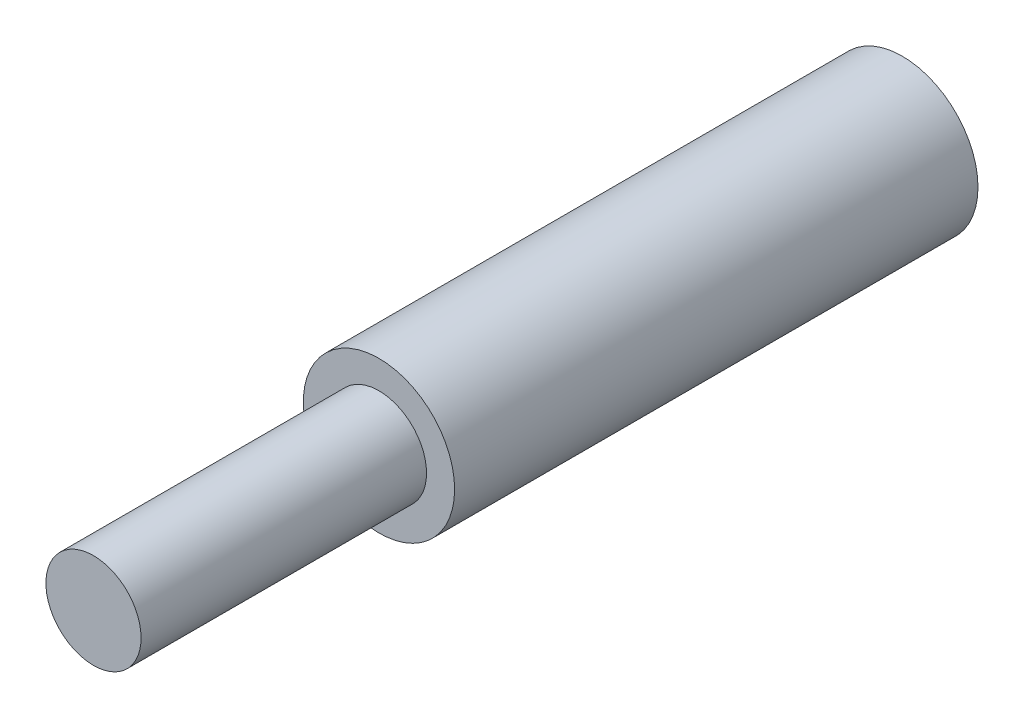
ISO-10303-21;
HEADER;
FILE_DESCRIPTION(('STEP AP214'),'2;1');
FILE_NAME('part.step','',(''),(''),'','','');
FILE_SCHEMA(('AUTOMOTIVE_DESIGN { 1 0 10303 214 1 1 1 1 }'));
ENDSEC;
DATA;
#1=APPLICATION_CONTEXT('core data for automotive mechanical design processes');
#2=APPLICATION_PROTOCOL_DEFINITION('international standard','automotive_design',2000,#1);
#3=PRODUCT_CONTEXT('',#1,'mechanical');
#4=PRODUCT('Part','Part','',(#3));
#5=PRODUCT_RELATED_PRODUCT_CATEGORY('part','',(#4));
#6=PRODUCT_DEFINITION_FORMATION('','',#4);
#7=PRODUCT_DEFINITION_CONTEXT('part definition',#1,'design');
#8=PRODUCT_DEFINITION('design','',#6,#7);
#9=PRODUCT_DEFINITION_SHAPE('','',#8);
#10=(LENGTH_UNIT() NAMED_UNIT(*) SI_UNIT(.MILLI.,.METRE.));
#11=(NAMED_UNIT(*) PLANE_ANGLE_UNIT() SI_UNIT($,.RADIAN.));
#12=(NAMED_UNIT(*) SI_UNIT($,.STERADIAN.) SOLID_ANGLE_UNIT());
#13=UNCERTAINTY_MEASURE_WITH_UNIT(LENGTH_MEASURE(1.E-05),#10,'distance_accuracy_value','');
#14=(GEOMETRIC_REPRESENTATION_CONTEXT(3) GLOBAL_UNCERTAINTY_ASSIGNED_CONTEXT((#13)) GLOBAL_UNIT_ASSIGNED_CONTEXT((#10,
#11,#12)) REPRESENTATION_CONTEXT('',''));
#15=CARTESIAN_POINT('',(0.,0.,0.));
#16=DIRECTION('',(0.,0.,1.));
#17=DIRECTION('',(1.,0.,0.));
#18=AXIS2_PLACEMENT_3D('',#15,#16,#17);
#19=CARTESIAN_POINT('',(0.,0.,11.));
#20=DIRECTION('',(0.,0.,-1.));
#21=DIRECTION('',(-1.,0.,0.));
#22=AXIS2_PLACEMENT_3D('',#19,#20,#21);
#23=CYLINDRICAL_SURFACE('',#22,1.59);
#24=CARTESIAN_POINT('',(0.,0.,11.));
#25=DIRECTION('',(0.,0.,1.));
#26=DIRECTION('',(1.,0.,0.));
#27=AXIS2_PLACEMENT_3D('',#24,#25,#26);
#28=CIRCLE('',#27,1.59);
#29=CARTESIAN_POINT('',(1.59,0.,11.));
#30=VERTEX_POINT('',#29);
#31=EDGE_CURVE('E49',#30,#30,#28,.T.);
#32=ORIENTED_EDGE('',*,*,#31,.F.);
#33=EDGE_LOOP('',(#32));
#34=FACE_BOUND('',#33,.T.);
#35=CARTESIAN_POINT('',(0.,0.,0.));
#36=DIRECTION('',(0.,0.,1.));
#37=DIRECTION('',(1.,0.,0.));
#38=AXIS2_PLACEMENT_3D('',#35,#36,#37);
#39=CIRCLE('',#38,1.59);
#40=CARTESIAN_POINT('',(1.59,0.,0.));
#41=VERTEX_POINT('',#40);
#42=EDGE_CURVE('E44',#41,#41,#39,.T.);
#43=ORIENTED_EDGE('',*,*,#42,.T.);
#44=EDGE_LOOP('',(#43));
#45=FACE_BOUND('',#44,.T.);
#46=ADVANCED_FACE('F41',(#34,#45),#23,.T.);
#47=CARTESIAN_POINT('',(0.,0.,11.));
#48=DIRECTION('',(0.,0.,1.));
#49=DIRECTION('',(1.,0.,0.));
#50=AXIS2_PLACEMENT_3D('',#47,#48,#49);
#51=PLANE('',#50);
#52=CARTESIAN_POINT('',(0.,0.,11.));
#53=DIRECTION('',(0.,0.,1.));
#54=DIRECTION('',(1.,0.,0.));
#55=AXIS2_PLACEMENT_3D('',#52,#53,#54);
#56=CIRCLE('',#55,1.);
#57=CARTESIAN_POINT('',(1.,0.,11.));
#58=VERTEX_POINT('',#57);
#59=EDGE_CURVE('E10',#58,#58,#56,.T.);
#60=ORIENTED_EDGE('',*,*,#59,.F.);
#61=EDGE_LOOP('',(#60));
#62=FACE_BOUND('',#61,.T.);
#63=ORIENTED_EDGE('',*,*,#31,.T.);
#64=EDGE_LOOP('',(#63));
#65=FACE_BOUND('',#64,.T.);
#66=ADVANCED_FACE('F69',(#62,#65),#51,.T.);
#67=CARTESIAN_POINT('',(0.,0.,0.));
#68=DIRECTION('',(0.,0.,1.));
#69=DIRECTION('',(1.,0.,0.));
#70=AXIS2_PLACEMENT_3D('',#67,#68,#69);
#71=PLANE('',#70);
#72=ORIENTED_EDGE('',*,*,#42,.F.);
#73=EDGE_LOOP('',(#72));
#74=FACE_BOUND('',#73,.T.);
#75=ADVANCED_FACE('F66',(#74),#71,.F.);
#76=CARTESIAN_POINT('',(0.,0.,17.));
#77=DIRECTION('',(0.,0.,-1.));
#78=DIRECTION('',(-1.,0.,0.));
#79=AXIS2_PLACEMENT_3D('',#76,#77,#78);
#80=CYLINDRICAL_SURFACE('',#79,1.);
#81=CARTESIAN_POINT('',(0.,0.,17.));
#82=DIRECTION('',(0.,0.,1.));
#83=DIRECTION('',(1.,0.,0.));
#84=AXIS2_PLACEMENT_3D('',#81,#82,#83);
#85=CIRCLE('',#84,1.);
#86=CARTESIAN_POINT('',(1.,0.,17.));
#87=VERTEX_POINT('',#86);
#88=EDGE_CURVE('E56',#87,#87,#85,.T.);
#89=ORIENTED_EDGE('',*,*,#88,.F.);
#90=EDGE_LOOP('',(#89));
#91=FACE_BOUND('',#90,.T.);
#92=ORIENTED_EDGE('',*,*,#59,.T.);
#93=EDGE_LOOP('',(#92));
#94=FACE_BOUND('',#93,.T.);
#95=ADVANCED_FACE('F68',(#91,#94),#80,.T.);
#96=CARTESIAN_POINT('',(0.,0.,17.));
#97=DIRECTION('',(0.,0.,1.));
#98=DIRECTION('',(1.,0.,0.));
#99=AXIS2_PLACEMENT_3D('',#96,#97,#98);
#100=PLANE('',#99);
#101=ORIENTED_EDGE('',*,*,#88,.T.);
#102=EDGE_LOOP('',(#101));
#103=FACE_BOUND('',#102,.T.);
#104=ADVANCED_FACE('F74',(#103),#100,.T.);
#105=CLOSED_SHELL('',(#46,#66,#75,#95,#104));
#106=MANIFOLD_SOLID_BREP('B2',#105);
#107=ADVANCED_BREP_SHAPE_REPRESENTATION('',(#18,#106),#14);
#108=SHAPE_DEFINITION_REPRESENTATION(#9,#107);
ENDSEC;
END-ISO-10303-21;
